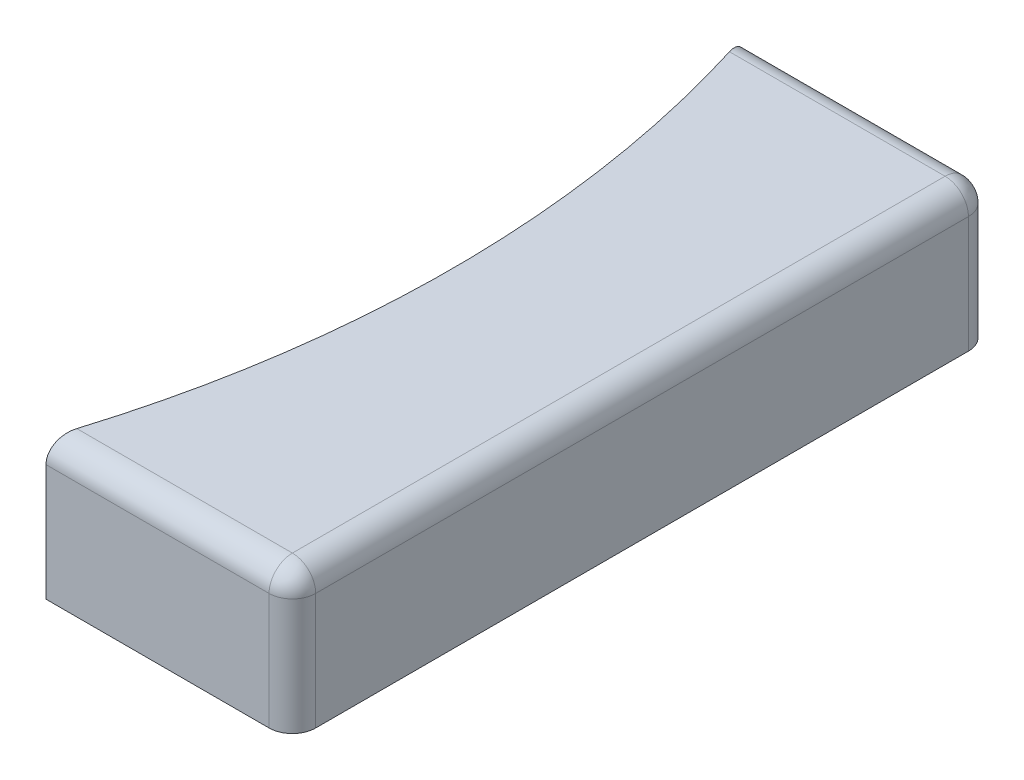
ISO-10303-21;
HEADER;
FILE_DESCRIPTION(('STEP AP214'),'2;1');
FILE_NAME('part.step','',(''),(''),'','','');
FILE_SCHEMA(('AUTOMOTIVE_DESIGN { 1 0 10303 214 1 1 1 1 }'));
ENDSEC;
DATA;
#1=APPLICATION_CONTEXT('core data for automotive mechanical design processes');
#2=APPLICATION_PROTOCOL_DEFINITION('international standard','automotive_design',2000,#1);
#3=PRODUCT_CONTEXT('',#1,'mechanical');
#4=PRODUCT('Part','Part','',(#3));
#5=PRODUCT_RELATED_PRODUCT_CATEGORY('part','',(#4));
#6=PRODUCT_DEFINITION_FORMATION('','',#4);
#7=PRODUCT_DEFINITION_CONTEXT('part definition',#1,'design');
#8=PRODUCT_DEFINITION('design','',#6,#7);
#9=PRODUCT_DEFINITION_SHAPE('','',#8);
#10=(LENGTH_UNIT() NAMED_UNIT(*) SI_UNIT(.MILLI.,.METRE.));
#11=(NAMED_UNIT(*) PLANE_ANGLE_UNIT() SI_UNIT($,.RADIAN.));
#12=(NAMED_UNIT(*) SI_UNIT($,.STERADIAN.) SOLID_ANGLE_UNIT());
#13=UNCERTAINTY_MEASURE_WITH_UNIT(LENGTH_MEASURE(1.E-05),#10,'distance_accuracy_value','');
#14=(GEOMETRIC_REPRESENTATION_CONTEXT(3) GLOBAL_UNCERTAINTY_ASSIGNED_CONTEXT((#13)) GLOBAL_UNIT_ASSIGNED_CONTEXT((#10,
#11,#12)) REPRESENTATION_CONTEXT('',''));
#15=CARTESIAN_POINT('',(0.,0.,0.));
#16=DIRECTION('',(0.,0.,1.));
#17=DIRECTION('',(1.,0.,0.));
#18=AXIS2_PLACEMENT_3D('',#15,#16,#17);
#19=CARTESIAN_POINT('',(-45.,6.,15.));
#20=DIRECTION('',(0.,-1.,0.));
#21=DIRECTION('',(0.,0.,-1.));
#22=AXIS2_PLACEMENT_3D('',#19,#20,#21);
#23=CYLINDRICAL_SURFACE('',#22,47.4341649025257);
#24=CARTESIAN_POINT('',(-45.,6.,15.));
#25=DIRECTION('',(0.,-1.,0.));
#26=DIRECTION('',(0.,0.,1.));
#27=AXIS2_PLACEMENT_3D('',#24,#25,#26);
#28=CIRCLE('',#27,47.4341649025257);
#29=CARTESIAN_POINT('',(0.321076774498635,6.,1.));
#30=VERTEX_POINT('',#29);
#31=CARTESIAN_POINT('',(0.321076774498635,6.,29.));
#32=VERTEX_POINT('',#31);
#33=EDGE_CURVE('E160',#30,#32,#28,.T.);
#34=ORIENTED_EDGE('',*,*,#33,.F.);
#35=CARTESIAN_POINT('',(0.321076774498642,6.,0.999999999999999));
#36=CARTESIAN_POINT('',(0.30301802802957,6.00003646723271,0.941524385691621));
#37=CARTESIAN_POINT('',(0.28483866426201,5.99487284616247,0.883090154978457));
#38=CARTESIAN_POINT('',(0.248764018385436,5.97443842040562,0.767892486481334));
#39=CARTESIAN_POINT('',(0.230868883831636,5.95916253102083,0.711129904248658));
#40=CARTESIAN_POINT('',(0.19589329722445,5.91878099792737,0.600881642289795));
#41=CARTESIAN_POINT('',(0.178813507475447,5.89366751059256,0.54739861684151));
#42=CARTESIAN_POINT('',(0.146054075034928,5.83419990002552,0.44539027592321));
#43=CARTESIAN_POINT('',(0.130373746464336,5.79985033690836,0.396862530159969));
#44=CARTESIAN_POINT('',(0.10127046549214,5.72350676394749,0.307226775122233));
#45=CARTESIAN_POINT('',(0.0878086912318602,5.68167908683592,0.265989962125582));
#46=CARTESIAN_POINT('',(0.0632980643261614,5.59100318767149,0.191194485722949));
#47=CARTESIAN_POINT('',(0.0522492887134301,5.54215474156979,0.15763606744079));
#48=CARTESIAN_POINT('',(0.0335021790013026,5.44128423397404,0.100854485992246));
#49=CARTESIAN_POINT('',(0.0256714606676975,5.38951696272542,0.077221807726796));
#50=CARTESIAN_POINT('',(0.0129969313383218,5.282425088743,0.0390335427841524));
#51=CARTESIAN_POINT('',(0.00814905000844792,5.22710544794444,0.0244655862170937));
#52=CARTESIAN_POINT('',(0.00327242937446179,5.14271338425706,0.00982007725572661));
#53=CARTESIAN_POINT('',(0.00204605124919553,5.11428917293839,0.00613921497332125));
#54=CARTESIAN_POINT('',(0.000410233208821616,5.05724835011858,0.00123064327748671));
#55=CARTESIAN_POINT('',(-3.97713442586126E-07,5.02863208041266,-6.42570114500173E-07));
#56=CARTESIAN_POINT('',(0.,5.00000000000003,-1.67584015257927E-13));
#57=B_SPLINE_CURVE_WITH_KNOTS('',3,(#35,#36,#37,#38,#39,#40,#41,#42,#43,#44,#45,#46,#47,#48,#49,
#50,#51,#52,#53,#54,#55,#56),.UNSPECIFIED.,.F.,.F.,(4,2,2,2,2,2,2,2,2,2,4),(0.,
0.183381906206538,0.366856091474848,0.550476861476073,0.734007138587206,0.913872835244059,
1.09374427310322,1.26521456814296,1.43645035545456,1.52241170656778,1.60824745988635),.UNSPECIFIED.);
#58=CARTESIAN_POINT('',(0.,5.,0.));
#59=VERTEX_POINT('',#58);
#60=EDGE_CURVE('E192',#30,#59,#57,.T.);
#61=ORIENTED_EDGE('',*,*,#60,.T.);
#62=DIRECTION('',(0.,-1.,0.));
#63=VECTOR('',#62,1.);
#64=CARTESIAN_POINT('',(0.,6.,0.));
#65=LINE('',#64,#63);
#66=CARTESIAN_POINT('',(0.,0.,0.));
#67=VERTEX_POINT('',#66);
#68=EDGE_CURVE('E163',#59,#67,#65,.T.);
#69=ORIENTED_EDGE('',*,*,#68,.T.);
#70=CARTESIAN_POINT('',(-45.,0.,15.));
#71=DIRECTION('',(0.,-1.,0.));
#72=DIRECTION('',(0.,0.,1.));
#73=AXIS2_PLACEMENT_3D('',#70,#71,#72);
#74=CIRCLE('',#73,47.4341649025257);
#75=CARTESIAN_POINT('',(0.321076774498642,0.,0.999999999999999));
#76=VERTEX_POINT('',#75);
#77=EDGE_CURVE('E165',#67,#76,#74,.T.);
#78=ORIENTED_EDGE('',*,*,#77,.T.);
#79=DIRECTION('',(0.,-1.,0.));
#80=VECTOR('',#79,1.);
#81=CARTESIAN_POINT('',(0.321076774498642,6.,0.999999999999999));
#82=LINE('',#81,#80);
#83=CARTESIAN_POINT('',(0.321076774498634,5.,1.));
#84=VERTEX_POINT('',#83);
#85=EDGE_CURVE('E146',#84,#76,#82,.T.);
#86=ORIENTED_EDGE('',*,*,#85,.F.);
#87=CARTESIAN_POINT('',(-45.,5.,15.));
#88=DIRECTION('',(0.,1.,0.));
#89=DIRECTION('',(0.,0.,1.));
#90=AXIS2_PLACEMENT_3D('',#87,#88,#89);
#91=CIRCLE('',#90,47.4341649025257);
#92=CARTESIAN_POINT('',(0.321076774498634,5.,29.));
#93=VERTEX_POINT('',#92);
#94=EDGE_CURVE('E133',#84,#93,#91,.F.);
#95=ORIENTED_EDGE('',*,*,#94,.T.);
#96=DIRECTION('',(0.,-1.,0.));
#97=VECTOR('',#96,1.);
#98=CARTESIAN_POINT('',(0.321076774498634,5.,29.));
#99=LINE('',#98,#97);
#100=CARTESIAN_POINT('',(0.321076774498642,0.,29.));
#101=VERTEX_POINT('',#100);
#102=EDGE_CURVE('E127',#93,#101,#99,.T.);
#103=ORIENTED_EDGE('',*,*,#102,.T.);
#104=CARTESIAN_POINT('',(0.,0.,30.));
#105=VERTEX_POINT('',#104);
#106=EDGE_CURVE('E153',#101,#105,#74,.T.);
#107=ORIENTED_EDGE('',*,*,#106,.T.);
#108=DIRECTION('',(0.,-1.,0.));
#109=VECTOR('',#108,1.);
#110=CARTESIAN_POINT('',(0.,6.,30.));
#111=LINE('',#110,#109);
#112=CARTESIAN_POINT('',(0.,5.,30.));
#113=VERTEX_POINT('',#112);
#114=EDGE_CURVE('E176',#113,#105,#111,.T.);
#115=ORIENTED_EDGE('',*,*,#114,.F.);
#116=CARTESIAN_POINT('',(0.,5.,30.));
#117=CARTESIAN_POINT('',(-3.30037908940886E-07,5.02711241864066,30.0000005502246));
#118=CARTESIAN_POINT('',(0.000367806603025147,5.05421143591932,29.9988966270471));
#119=CARTESIAN_POINT('',(0.00183386954498468,5.10820687811975,29.9944975364668));
#120=CARTESIAN_POINT('',(0.00293168022986405,5.1351033344544,29.9912027162094));
#121=CARTESIAN_POINT('',(0.00730006151262472,5.21507293922857,29.978085031362));
#122=CARTESIAN_POINT('',(0.0116456807504437,5.26759612908846,29.9650286877434));
#123=CARTESIAN_POINT('',(0.0230230476173793,5.36956136286006,29.930764109464));
#124=CARTESIAN_POINT('',(0.0300546513819726,5.41900357162784,29.9095563114045));
#125=CARTESIAN_POINT('',(0.0465268041859197,5.51356356631584,29.859714310393));
#126=CARTESIAN_POINT('',(0.0559679511334837,5.55868027507089,29.8310782641537));
#127=CARTESIAN_POINT('',(0.0771512842774322,5.64444882319888,29.7665705834814));
#128=CARTESIAN_POINT('',(0.0889405818652383,5.68497695529316,29.7305502725846));
#129=CARTESIAN_POINT('',(0.114273159143298,5.7594575712717,29.6527822612513));
#130=CARTESIAN_POINT('',(0.127816912092738,5.79340827472478,29.6110330152704));
#131=CARTESIAN_POINT('',(0.156923460265123,5.85549569932802,29.520833737705));
#132=CARTESIAN_POINT('',(0.172552153084126,5.88327273503543,29.4721575523829));
#133=CARTESIAN_POINT('',(0.204794065989692,5.9302499523521,29.3711309287008));
#134=CARTESIAN_POINT('',(0.221407303193297,5.94944998479415,29.318780426457));
#135=CARTESIAN_POINT('',(0.251906481111711,5.97606385298324,29.2220606755401));
#136=CARTESIAN_POINT('',(0.265705267313268,5.98503086490193,29.1780834482988));
#137=CARTESIAN_POINT('',(0.293383427357092,5.99699958456693,29.0894147554626));
#138=CARTESIAN_POINT('',(0.307262669874343,6.00000919686773,29.0447243157163));
#139=CARTESIAN_POINT('',(0.321076774498643,6.,29.));
#140=B_SPLINE_CURVE_WITH_KNOTS('',3,(#116,#117,#118,#119,#120,#121,#122,#123,#124,#125,#126,
#127,#128,#129,#130,#131,#132,#133,#134,#135,#136,#137,#138,#139),.UNSPECIFIED.,.F.,.F.,(4,2,2,
2,2,2,2,2,2,2,2,4),(0.,0.0812858961863813,0.16255891577059,0.324602197223098,0.486636800661582,
0.64871165080596,0.81444334623093,0.980219840751543,1.15399726564414,1.32777771267434,
1.46827026746162,1.60857628491417),.UNSPECIFIED.);
#141=EDGE_CURVE('E185',#113,#32,#140,.T.);
#142=ORIENTED_EDGE('',*,*,#141,.T.);
#143=EDGE_LOOP('',(#34,#61,#69,#78,#86,#95,#103,#107,#115,#142));
#144=FACE_BOUND('',#143,.T.);
#145=ADVANCED_FACE('F33',(#144),#23,.F.);
#146=CARTESIAN_POINT('',(10.57,6.,30.));
#147=DIRECTION('',(0.,0.,-1.));
#148=DIRECTION('',(-1.,0.,0.));
#149=AXIS2_PLACEMENT_3D('',#146,#147,#148);
#150=PLANE('',#149);
#151=DIRECTION('',(0.,-1.,0.));
#152=VECTOR('',#151,1.);
#153=CARTESIAN_POINT('',(9.57,6.,30.));
#154=LINE('',#153,#152);
#155=CARTESIAN_POINT('',(9.57,0.,30.));
#156=VERTEX_POINT('',#155);
#157=CARTESIAN_POINT('',(9.57,5.,30.));
#158=VERTEX_POINT('',#157);
#159=EDGE_CURVE('E262',#156,#158,#154,.F.);
#160=ORIENTED_EDGE('',*,*,#159,.T.);
#161=DIRECTION('',(1.,0.,0.));
#162=VECTOR('',#161,1.);
#163=CARTESIAN_POINT('',(0.,5.,30.));
#164=LINE('',#163,#162);
#165=EDGE_CURVE('E260',#158,#113,#164,.F.);
#166=ORIENTED_EDGE('',*,*,#165,.T.);
#167=ORIENTED_EDGE('',*,*,#114,.T.);
#168=DIRECTION('',(1.,0.,0.));
#169=VECTOR('',#168,1.);
#170=CARTESIAN_POINT('',(10.57,0.,30.));
#171=LINE('',#170,#169);
#172=EDGE_CURVE('E168',#105,#156,#171,.T.);
#173=ORIENTED_EDGE('',*,*,#172,.T.);
#174=EDGE_LOOP('',(#160,#166,#167,#173));
#175=FACE_BOUND('',#174,.T.);
#176=ADVANCED_FACE('F205',(#175),#150,.F.);
#177=CARTESIAN_POINT('',(10.57,6.,0.));
#178=DIRECTION('',(-1.,0.,0.));
#179=DIRECTION('',(0.,0.,1.));
#180=AXIS2_PLACEMENT_3D('',#177,#178,#179);
#181=PLANE('',#180);
#182=DIRECTION('',(0.,0.,-1.));
#183=VECTOR('',#182,1.);
#184=CARTESIAN_POINT('',(10.57,0.,0.));
#185=LINE('',#184,#183);
#186=CARTESIAN_POINT('',(10.57,0.,29.));
#187=VERTEX_POINT('',#186);
#188=CARTESIAN_POINT('',(10.57,0.,1.));
#189=VERTEX_POINT('',#188);
#190=EDGE_CURVE('E171',#187,#189,#185,.T.);
#191=ORIENTED_EDGE('',*,*,#190,.T.);
#192=DIRECTION('',(0.,-1.,0.));
#193=VECTOR('',#192,1.);
#194=CARTESIAN_POINT('',(10.57,6.,1.));
#195=LINE('',#194,#193);
#196=CARTESIAN_POINT('',(10.57,5.,1.));
#197=VERTEX_POINT('',#196);
#198=EDGE_CURVE('E11',#189,#197,#195,.F.);
#199=ORIENTED_EDGE('',*,*,#198,.T.);
#200=DIRECTION('',(0.,0.,-1.));
#201=VECTOR('',#200,1.);
#202=CARTESIAN_POINT('',(10.57,5.,30.));
#203=LINE('',#202,#201);
#204=CARTESIAN_POINT('',(10.57,5.,29.));
#205=VERTEX_POINT('',#204);
#206=EDGE_CURVE('E49',#197,#205,#203,.F.);
#207=ORIENTED_EDGE('',*,*,#206,.T.);
#208=DIRECTION('',(0.,-1.,0.));
#209=VECTOR('',#208,1.);
#210=CARTESIAN_POINT('',(10.57,6.,29.));
#211=LINE('',#210,#209);
#212=EDGE_CURVE('E42',#205,#187,#211,.T.);
#213=ORIENTED_EDGE('',*,*,#212,.T.);
#214=EDGE_LOOP('',(#191,#199,#207,#213));
#215=FACE_BOUND('',#214,.T.);
#216=ADVANCED_FACE('F283',(#215),#181,.F.);
#217=CARTESIAN_POINT('',(0.,6.,0.));
#218=DIRECTION('',(0.,0.,1.));
#219=DIRECTION('',(1.,0.,0.));
#220=AXIS2_PLACEMENT_3D('',#217,#218,#219);
#221=PLANE('',#220);
#222=ORIENTED_EDGE('',*,*,#68,.F.);
#223=DIRECTION('',(-1.,0.,0.));
#224=VECTOR('',#223,1.);
#225=CARTESIAN_POINT('',(10.57,5.,0.));
#226=LINE('',#225,#224);
#227=CARTESIAN_POINT('',(9.56999999999999,5.,0.));
#228=VERTEX_POINT('',#227);
#229=EDGE_CURVE('E264',#59,#228,#226,.F.);
#230=ORIENTED_EDGE('',*,*,#229,.T.);
#231=DIRECTION('',(0.,-1.,0.));
#232=VECTOR('',#231,1.);
#233=CARTESIAN_POINT('',(9.56999999999999,6.,0.));
#234=LINE('',#233,#232);
#235=CARTESIAN_POINT('',(9.56999999999999,0.,0.));
#236=VERTEX_POINT('',#235);
#237=EDGE_CURVE('E265',#228,#236,#234,.T.);
#238=ORIENTED_EDGE('',*,*,#237,.T.);
#239=DIRECTION('',(-1.,0.,0.));
#240=VECTOR('',#239,1.);
#241=CARTESIAN_POINT('',(0.,0.,0.));
#242=LINE('',#241,#240);
#243=EDGE_CURVE('E164',#236,#67,#242,.T.);
#244=ORIENTED_EDGE('',*,*,#243,.T.);
#245=EDGE_LOOP('',(#222,#230,#238,#244));
#246=FACE_BOUND('',#245,.T.);
#247=ADVANCED_FACE('F274',(#246),#221,.F.);
#248=CARTESIAN_POINT('',(-45.,6.,15.));
#249=DIRECTION('',(0.,1.,0.));
#250=DIRECTION('',(0.,0.,1.));
#251=AXIS2_PLACEMENT_3D('',#248,#249,#250);
#252=PLANE('',#251);
#253=DIRECTION('',(0.,0.,-1.));
#254=VECTOR('',#253,1.);
#255=CARTESIAN_POINT('',(9.56999999999999,6.,0.));
#256=LINE('',#255,#254);
#257=CARTESIAN_POINT('',(9.57,6.,29.));
#258=VERTEX_POINT('',#257);
#259=CARTESIAN_POINT('',(9.56999999999999,6.,0.999999999999999));
#260=VERTEX_POINT('',#259);
#261=EDGE_CURVE('E178',#258,#260,#256,.T.);
#262=ORIENTED_EDGE('',*,*,#261,.T.);
#263=DIRECTION('',(-1.,0.,0.));
#264=VECTOR('',#263,1.);
#265=CARTESIAN_POINT('',(0.,6.,0.999999999999999));
#266=LINE('',#265,#264);
#267=EDGE_CURVE('E182',#260,#30,#266,.T.);
#268=ORIENTED_EDGE('',*,*,#267,.T.);
#269=ORIENTED_EDGE('',*,*,#33,.T.);
#270=DIRECTION('',(1.,0.,0.));
#271=VECTOR('',#270,1.);
#272=CARTESIAN_POINT('',(10.57,6.,29.));
#273=LINE('',#272,#271);
#274=EDGE_CURVE('E180',#32,#258,#273,.T.);
#275=ORIENTED_EDGE('',*,*,#274,.T.);
#276=EDGE_LOOP('',(#262,#268,#269,#275));
#277=FACE_BOUND('',#276,.T.);
#278=ADVANCED_FACE('F306',(#277),#252,.T.);
#279=CARTESIAN_POINT('',(-45.,0.,15.));
#280=DIRECTION('',(0.,1.,0.));
#281=DIRECTION('',(0.,0.,1.));
#282=AXIS2_PLACEMENT_3D('',#279,#280,#281);
#283=PLANE('',#282);
#284=ORIENTED_EDGE('',*,*,#243,.F.);
#285=CARTESIAN_POINT('',(9.56999999999999,0.,1.));
#286=DIRECTION('',(0.,1.,0.));
#287=DIRECTION('',(0.,0.,1.));
#288=AXIS2_PLACEMENT_3D('',#285,#286,#287);
#289=CIRCLE('',#288,1.);
#290=EDGE_CURVE('E256',#236,#189,#289,.F.);
#291=ORIENTED_EDGE('',*,*,#290,.T.);
#292=ORIENTED_EDGE('',*,*,#190,.F.);
#293=CARTESIAN_POINT('',(9.57,0.,29.));
#294=DIRECTION('',(0.,1.,0.));
#295=DIRECTION('',(0.,0.,1.));
#296=AXIS2_PLACEMENT_3D('',#293,#294,#295);
#297=CIRCLE('',#296,1.);
#298=EDGE_CURVE('E258',#187,#156,#297,.F.);
#299=ORIENTED_EDGE('',*,*,#298,.T.);
#300=ORIENTED_EDGE('',*,*,#172,.F.);
#301=ORIENTED_EDGE('',*,*,#106,.F.);
#302=DIRECTION('',(1.,0.,0.));
#303=VECTOR('',#302,1.);
#304=CARTESIAN_POINT('',(10.57,0.,29.));
#305=LINE('',#304,#303);
#306=CARTESIAN_POINT('',(9.57,0.,29.));
#307=VERTEX_POINT('',#306);
#308=EDGE_CURVE('E150',#101,#307,#305,.T.);
#309=ORIENTED_EDGE('',*,*,#308,.T.);
#310=DIRECTION('',(0.,0.,-1.));
#311=VECTOR('',#310,1.);
#312=CARTESIAN_POINT('',(9.56999999999999,0.,0.));
#313=LINE('',#312,#311);
#314=CARTESIAN_POINT('',(9.56999999999999,0.,1.));
#315=VERTEX_POINT('',#314);
#316=EDGE_CURVE('E139',#307,#315,#313,.T.);
#317=ORIENTED_EDGE('',*,*,#316,.T.);
#318=DIRECTION('',(-1.,0.,0.));
#319=VECTOR('',#318,1.);
#320=CARTESIAN_POINT('',(0.,0.,1.));
#321=LINE('',#320,#319);
#322=EDGE_CURVE('E155',#315,#76,#321,.T.);
#323=ORIENTED_EDGE('',*,*,#322,.T.);
#324=ORIENTED_EDGE('',*,*,#77,.F.);
#325=EDGE_LOOP('',(#284,#291,#292,#299,#300,#301,#309,#317,#323,#324));
#326=FACE_BOUND('',#325,.T.);
#327=ADVANCED_FACE('F281',(#326),#283,.F.);
#328=CARTESIAN_POINT('',(10.57,6.,29.));
#329=DIRECTION('',(0.,0.,-1.));
#330=DIRECTION('',(-1.,0.,0.));
#331=AXIS2_PLACEMENT_3D('',#328,#329,#330);
#332=PLANE('',#331);
#333=ORIENTED_EDGE('',*,*,#308,.F.);
#334=ORIENTED_EDGE('',*,*,#102,.F.);
#335=DIRECTION('',(1.,0.,0.));
#336=VECTOR('',#335,1.);
#337=CARTESIAN_POINT('',(10.57,5.,29.));
#338=LINE('',#337,#336);
#339=CARTESIAN_POINT('',(9.57,5.,29.));
#340=VERTEX_POINT('',#339);
#341=EDGE_CURVE('E121',#93,#340,#338,.T.);
#342=ORIENTED_EDGE('',*,*,#341,.T.);
#343=DIRECTION('',(0.,-1.,0.));
#344=VECTOR('',#343,1.);
#345=CARTESIAN_POINT('',(9.57,6.,29.));
#346=LINE('',#345,#344);
#347=EDGE_CURVE('E124',#340,#307,#346,.T.);
#348=ORIENTED_EDGE('',*,*,#347,.T.);
#349=EDGE_LOOP('',(#333,#334,#342,#348));
#350=FACE_BOUND('',#349,.T.);
#351=ADVANCED_FACE('F123',(#350),#332,.T.);
#352=CARTESIAN_POINT('',(9.56999999999999,6.,0.));
#353=DIRECTION('',(-1.,0.,0.));
#354=DIRECTION('',(0.,0.,1.));
#355=AXIS2_PLACEMENT_3D('',#352,#353,#354);
#356=PLANE('',#355);
#357=ORIENTED_EDGE('',*,*,#316,.F.);
#358=ORIENTED_EDGE('',*,*,#347,.F.);
#359=DIRECTION('',(0.,0.,-1.));
#360=VECTOR('',#359,1.);
#361=CARTESIAN_POINT('',(9.56999999999999,5.,0.));
#362=LINE('',#361,#360);
#363=CARTESIAN_POINT('',(9.56999999999999,5.,1.));
#364=VERTEX_POINT('',#363);
#365=EDGE_CURVE('E132',#340,#364,#362,.T.);
#366=ORIENTED_EDGE('',*,*,#365,.T.);
#367=DIRECTION('',(0.,-1.,0.));
#368=VECTOR('',#367,1.);
#369=CARTESIAN_POINT('',(9.56999999999999,6.,1.));
#370=LINE('',#369,#368);
#371=EDGE_CURVE('E140',#364,#315,#370,.T.);
#372=ORIENTED_EDGE('',*,*,#371,.T.);
#373=EDGE_LOOP('',(#357,#358,#366,#372));
#374=FACE_BOUND('',#373,.T.);
#375=ADVANCED_FACE('F136',(#374),#356,.T.);
#376=CARTESIAN_POINT('',(0.,6.,1.));
#377=DIRECTION('',(0.,0.,1.));
#378=DIRECTION('',(1.,0.,0.));
#379=AXIS2_PLACEMENT_3D('',#376,#377,#378);
#380=PLANE('',#379);
#381=ORIENTED_EDGE('',*,*,#322,.F.);
#382=ORIENTED_EDGE('',*,*,#371,.F.);
#383=DIRECTION('',(-1.,0.,0.));
#384=VECTOR('',#383,1.);
#385=CARTESIAN_POINT('',(0.,5.,1.));
#386=LINE('',#385,#384);
#387=EDGE_CURVE('E144',#364,#84,#386,.T.);
#388=ORIENTED_EDGE('',*,*,#387,.T.);
#389=ORIENTED_EDGE('',*,*,#85,.T.);
#390=EDGE_LOOP('',(#381,#382,#388,#389));
#391=FACE_BOUND('',#390,.T.);
#392=ADVANCED_FACE('F295',(#391),#380,.T.);
#393=CARTESIAN_POINT('',(-45.,5.,15.));
#394=DIRECTION('',(0.,1.,0.));
#395=DIRECTION('',(0.,0.,1.));
#396=AXIS2_PLACEMENT_3D('',#393,#394,#395);
#397=PLANE('',#396);
#398=ORIENTED_EDGE('',*,*,#94,.F.);
#399=ORIENTED_EDGE('',*,*,#387,.F.);
#400=ORIENTED_EDGE('',*,*,#365,.F.);
#401=ORIENTED_EDGE('',*,*,#341,.F.);
#402=EDGE_LOOP('',(#398,#399,#400,#401));
#403=FACE_BOUND('',#402,.T.);
#404=ADVANCED_FACE('F143',(#403),#397,.F.);
#405=CARTESIAN_POINT('',(9.57,6.,29.));
#406=DIRECTION('',(0.,-1.,0.));
#407=DIRECTION('',(0.,0.,-1.));
#408=AXIS2_PLACEMENT_3D('',#405,#406,#407);
#409=CYLINDRICAL_SURFACE('',#408,1.);
#410=ORIENTED_EDGE('',*,*,#298,.F.);
#411=ORIENTED_EDGE('',*,*,#212,.F.);
#412=CARTESIAN_POINT('',(9.57,5.,29.));
#413=DIRECTION('',(0.,1.,0.));
#414=DIRECTION('',(0.,0.,1.));
#415=AXIS2_PLACEMENT_3D('',#412,#413,#414);
#416=CIRCLE('',#415,1.);
#417=EDGE_CURVE('E37',#158,#205,#416,.T.);
#418=ORIENTED_EDGE('',*,*,#417,.F.);
#419=ORIENTED_EDGE('',*,*,#159,.F.);
#420=EDGE_LOOP('',(#410,#411,#418,#419));
#421=FACE_BOUND('',#420,.T.);
#422=ADVANCED_FACE('F35',(#421),#409,.T.);
#423=CARTESIAN_POINT('',(-45.,5.,29.));
#424=DIRECTION('',(-1.,0.,0.));
#425=DIRECTION('',(0.,0.,1.));
#426=AXIS2_PLACEMENT_3D('',#423,#424,#425);
#427=CYLINDRICAL_SURFACE('',#426,1.);
#428=ORIENTED_EDGE('',*,*,#141,.F.);
#429=ORIENTED_EDGE('',*,*,#165,.F.);
#430=CARTESIAN_POINT('',(9.57,5.,29.));
#431=DIRECTION('',(1.,0.,0.));
#432=DIRECTION('',(0.,0.,-1.));
#433=AXIS2_PLACEMENT_3D('',#430,#431,#432);
#434=CIRCLE('',#433,1.);
#435=EDGE_CURVE('E236',#258,#158,#434,.T.);
#436=ORIENTED_EDGE('',*,*,#435,.F.);
#437=ORIENTED_EDGE('',*,*,#274,.F.);
#438=EDGE_LOOP('',(#428,#429,#436,#437));
#439=FACE_BOUND('',#438,.T.);
#440=ADVANCED_FACE('F199',(#439),#427,.T.);
#441=CARTESIAN_POINT('',(9.57,5.,29.));
#442=DIRECTION('',(0.,0.,1.));
#443=DIRECTION('',(1.,0.,0.));
#444=AXIS2_PLACEMENT_3D('',#441,#442,#443);
#445=SPHERICAL_SURFACE('',#444,1.);
#446=ORIENTED_EDGE('',*,*,#435,.T.);
#447=ORIENTED_EDGE('',*,*,#417,.T.);
#448=CARTESIAN_POINT('',(9.57,5.,29.));
#449=DIRECTION('',(0.,0.,1.));
#450=DIRECTION('',(1.,0.,0.));
#451=AXIS2_PLACEMENT_3D('',#448,#449,#450);
#452=CIRCLE('',#451,1.);
#453=EDGE_CURVE('E239',#258,#205,#452,.F.);
#454=ORIENTED_EDGE('',*,*,#453,.F.);
#455=EDGE_LOOP('',(#446,#447,#454));
#456=FACE_BOUND('',#455,.T.);
#457=ADVANCED_FACE('F224',(#456),#445,.T.);
#458=CARTESIAN_POINT('',(9.56999999999999,6.,1.));
#459=DIRECTION('',(0.,-1.,0.));
#460=DIRECTION('',(0.,0.,-1.));
#461=AXIS2_PLACEMENT_3D('',#458,#459,#460);
#462=CYLINDRICAL_SURFACE('',#461,1.);
#463=ORIENTED_EDGE('',*,*,#290,.F.);
#464=ORIENTED_EDGE('',*,*,#237,.F.);
#465=CARTESIAN_POINT('',(9.56999999999999,5.,1.));
#466=DIRECTION('',(0.,1.,0.));
#467=DIRECTION('',(0.,0.,1.));
#468=AXIS2_PLACEMENT_3D('',#465,#466,#467);
#469=CIRCLE('',#468,1.);
#470=EDGE_CURVE('E243',#197,#228,#469,.T.);
#471=ORIENTED_EDGE('',*,*,#470,.F.);
#472=ORIENTED_EDGE('',*,*,#198,.F.);
#473=EDGE_LOOP('',(#463,#464,#471,#472));
#474=FACE_BOUND('',#473,.T.);
#475=ADVANCED_FACE('F221',(#474),#462,.T.);
#476=CARTESIAN_POINT('',(9.56999999999999,5.,15.));
#477=DIRECTION('',(0.,0.,1.));
#478=DIRECTION('',(1.,0.,0.));
#479=AXIS2_PLACEMENT_3D('',#476,#477,#478);
#480=CYLINDRICAL_SURFACE('',#479,1.);
#481=ORIENTED_EDGE('',*,*,#453,.T.);
#482=ORIENTED_EDGE('',*,*,#206,.F.);
#483=CARTESIAN_POINT('',(9.56999999999999,5.,0.999999999999999));
#484=DIRECTION('',(0.,0.,-1.));
#485=DIRECTION('',(-1.,0.,0.));
#486=AXIS2_PLACEMENT_3D('',#483,#484,#485);
#487=CIRCLE('',#486,1.);
#488=EDGE_CURVE('E248',#260,#197,#487,.T.);
#489=ORIENTED_EDGE('',*,*,#488,.F.);
#490=ORIENTED_EDGE('',*,*,#261,.F.);
#491=EDGE_LOOP('',(#481,#482,#489,#490));
#492=FACE_BOUND('',#491,.T.);
#493=ADVANCED_FACE('F217',(#492),#480,.T.);
#494=CARTESIAN_POINT('',(9.56999999999999,5.,1.));
#495=DIRECTION('',(0.,0.,1.));
#496=DIRECTION('',(1.,0.,0.));
#497=AXIS2_PLACEMENT_3D('',#494,#495,#496);
#498=SPHERICAL_SURFACE('',#497,1.);
#499=ORIENTED_EDGE('',*,*,#488,.T.);
#500=ORIENTED_EDGE('',*,*,#470,.T.);
#501=CARTESIAN_POINT('',(9.56999999999999,5.,1.));
#502=DIRECTION('',(1.,0.,0.));
#503=DIRECTION('',(0.,1.,0.));
#504=AXIS2_PLACEMENT_3D('',#501,#502,#503);
#505=CIRCLE('',#504,1.);
#506=EDGE_CURVE('E251',#260,#228,#505,.F.);
#507=ORIENTED_EDGE('',*,*,#506,.F.);
#508=EDGE_LOOP('',(#499,#500,#507));
#509=FACE_BOUND('',#508,.T.);
#510=ADVANCED_FACE('F213',(#509),#498,.T.);
#511=CARTESIAN_POINT('',(-45.,5.,0.999999999999999));
#512=DIRECTION('',(1.,0.,0.));
#513=DIRECTION('',(0.,0.,-1.));
#514=AXIS2_PLACEMENT_3D('',#511,#512,#513);
#515=CYLINDRICAL_SURFACE('',#514,1.);
#516=ORIENTED_EDGE('',*,*,#506,.T.);
#517=ORIENTED_EDGE('',*,*,#229,.F.);
#518=ORIENTED_EDGE('',*,*,#60,.F.);
#519=ORIENTED_EDGE('',*,*,#267,.F.);
#520=EDGE_LOOP('',(#516,#517,#518,#519));
#521=FACE_BOUND('',#520,.T.);
#522=ADVANCED_FACE('F208',(#521),#515,.T.);
#523=CLOSED_SHELL('',(#145,#176,#216,#247,#278,#327,#351,#375,#392,#404,#422,#440,#457,#475,
#493,#510,#522));
#524=MANIFOLD_SOLID_BREP('B2',#523);
#525=ADVANCED_BREP_SHAPE_REPRESENTATION('',(#18,#524),#14);
#526=SHAPE_DEFINITION_REPRESENTATION(#9,#525);
ENDSEC;
END-ISO-10303-21;
